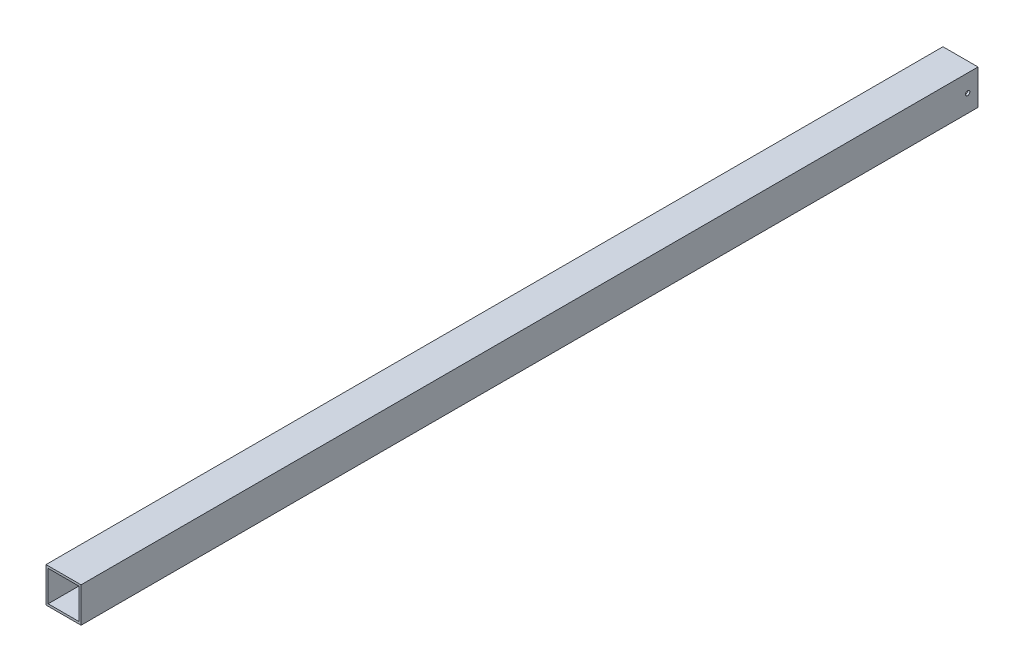
ISO-10303-21;
HEADER;
FILE_DESCRIPTION(('STEP AP214'),'2;1');
FILE_NAME('part.step','',(''),(''),'','','');
FILE_SCHEMA(('AUTOMOTIVE_DESIGN { 1 0 10303 214 1 1 1 1 }'));
ENDSEC;
DATA;
#1=APPLICATION_CONTEXT('core data for automotive mechanical design processes');
#2=APPLICATION_PROTOCOL_DEFINITION('international standard','automotive_design',2000,#1);
#3=PRODUCT_CONTEXT('',#1,'mechanical');
#4=PRODUCT('Part','Part','',(#3));
#5=PRODUCT_RELATED_PRODUCT_CATEGORY('part','',(#4));
#6=PRODUCT_DEFINITION_FORMATION('','',#4);
#7=PRODUCT_DEFINITION_CONTEXT('part definition',#1,'design');
#8=PRODUCT_DEFINITION('design','',#6,#7);
#9=PRODUCT_DEFINITION_SHAPE('','',#8);
#10=(LENGTH_UNIT() NAMED_UNIT(*) SI_UNIT(.MILLI.,.METRE.));
#11=(NAMED_UNIT(*) PLANE_ANGLE_UNIT() SI_UNIT($,.RADIAN.));
#12=(NAMED_UNIT(*) SI_UNIT($,.STERADIAN.) SOLID_ANGLE_UNIT());
#13=UNCERTAINTY_MEASURE_WITH_UNIT(LENGTH_MEASURE(1.E-05),#10,'distance_accuracy_value','');
#14=(GEOMETRIC_REPRESENTATION_CONTEXT(3) GLOBAL_UNCERTAINTY_ASSIGNED_CONTEXT((#13)) GLOBAL_UNIT_ASSIGNED_CONTEXT((#10,
#11,#12)) REPRESENTATION_CONTEXT('',''));
#15=CARTESIAN_POINT('',(0.,0.,0.));
#16=DIRECTION('',(0.,0.,1.));
#17=DIRECTION('',(1.,0.,0.));
#18=AXIS2_PLACEMENT_3D('',#15,#16,#17);
#19=CARTESIAN_POINT('',(-25.4,25.3999999999999,649.999999972));
#20=DIRECTION('',(1.,0.,0.));
#21=DIRECTION('',(0.,0.,-1.));
#22=AXIS2_PLACEMENT_3D('',#19,#20,#21);
#23=PLANE('',#22);
#24=CARTESIAN_POINT('',(-25.4,0.,-634.999999972));
#25=DIRECTION('',(-1.,0.,0.));
#26=DIRECTION('',(0.,0.,1.));
#27=AXIS2_PLACEMENT_3D('',#24,#25,#26);
#28=CIRCLE('',#27,3.17500000000008);
#29=CARTESIAN_POINT('',(-25.4,0.,-631.824999972));
#30=VERTEX_POINT('',#29);
#31=EDGE_CURVE('E282',#30,#30,#28,.T.);
#32=ORIENTED_EDGE('',*,*,#31,.F.);
#33=EDGE_LOOP('',(#32));
#34=FACE_BOUND('',#33,.T.);
#35=DIRECTION('',(0.,-1.,0.));
#36=VECTOR('',#35,1.);
#37=CARTESIAN_POINT('',(-25.4,25.3999999999999,-649.999999972));
#38=LINE('',#37,#36);
#39=CARTESIAN_POINT('',(-25.4,25.3999999999999,-649.999999972));
#40=VERTEX_POINT('',#39);
#41=CARTESIAN_POINT('',(-25.4,-25.3999999999999,-649.999999972));
#42=VERTEX_POINT('',#41);
#43=EDGE_CURVE('E159',#40,#42,#38,.T.);
#44=ORIENTED_EDGE('',*,*,#43,.T.);
#45=DIRECTION('',(0.,0.,-1.));
#46=VECTOR('',#45,1.);
#47=CARTESIAN_POINT('',(-25.4,-25.3999999999999,649.999999972));
#48=LINE('',#47,#46);
#49=CARTESIAN_POINT('',(-25.4,-25.3999999999999,649.999999972));
#50=VERTEX_POINT('',#49);
#51=EDGE_CURVE('E164',#50,#42,#48,.T.);
#52=ORIENTED_EDGE('',*,*,#51,.F.);
#53=DIRECTION('',(0.,-1.,0.));
#54=VECTOR('',#53,1.);
#55=CARTESIAN_POINT('',(-25.4,25.3999999999999,649.999999972));
#56=LINE('',#55,#54);
#57=CARTESIAN_POINT('',(-25.4,25.3999999999999,649.999999972));
#58=VERTEX_POINT('',#57);
#59=EDGE_CURVE('E150',#58,#50,#56,.T.);
#60=ORIENTED_EDGE('',*,*,#59,.F.);
#61=DIRECTION('',(0.,0.,-1.));
#62=VECTOR('',#61,1.);
#63=CARTESIAN_POINT('',(-25.4,25.3999999999999,649.999999972));
#64=LINE('',#63,#62);
#65=EDGE_CURVE('E48',#58,#40,#64,.T.);
#66=ORIENTED_EDGE('',*,*,#65,.T.);
#67=EDGE_LOOP('',(#44,#52,#60,#66));
#68=FACE_BOUND('',#67,.T.);
#69=CARTESIAN_POINT('',(-25.4,-3.17499999999772,597.099999971999));
#70=DIRECTION('',(-1.,0.,0.));
#71=DIRECTION('',(0.,0.,1.));
#72=AXIS2_PLACEMENT_3D('',#69,#70,#71);
#73=CIRCLE('',#72,2.425);
#74=CARTESIAN_POINT('',(-25.4,-3.17499999999772,599.524999971999));
#75=VERTEX_POINT('',#74);
#76=EDGE_CURVE('E273',#75,#75,#73,.T.);
#77=ORIENTED_EDGE('',*,*,#76,.F.);
#78=EDGE_LOOP('',(#77));
#79=FACE_BOUND('',#78,.T.);
#80=CARTESIAN_POINT('',(-25.4,-3.17499999999776,557.099999971999));
#81=DIRECTION('',(-1.,0.,0.));
#82=DIRECTION('',(0.,0.,1.));
#83=AXIS2_PLACEMENT_3D('',#80,#81,#82);
#84=CIRCLE('',#83,2.425);
#85=CARTESIAN_POINT('',(-25.4,-3.17499999999776,559.524999971999));
#86=VERTEX_POINT('',#85);
#87=EDGE_CURVE('E264',#86,#86,#84,.T.);
#88=ORIENTED_EDGE('',*,*,#87,.F.);
#89=EDGE_LOOP('',(#88));
#90=FACE_BOUND('',#89,.T.);
#91=CARTESIAN_POINT('',(-25.4,-3.17499999999779,517.099999971999));
#92=DIRECTION('',(-1.,0.,0.));
#93=DIRECTION('',(0.,0.,1.));
#94=AXIS2_PLACEMENT_3D('',#91,#92,#93);
#95=CIRCLE('',#94,2.425);
#96=CARTESIAN_POINT('',(-25.4,-3.17499999999779,519.524999971999));
#97=VERTEX_POINT('',#96);
#98=EDGE_CURVE('E256',#97,#97,#95,.T.);
#99=ORIENTED_EDGE('',*,*,#98,.F.);
#100=EDGE_LOOP('',(#99));
#101=FACE_BOUND('',#100,.T.);
#102=ADVANCED_FACE('F39',(#34,#68,#79,#90,#101),#23,.F.);
#103=CARTESIAN_POINT('',(0.,0.,649.999999972));
#104=DIRECTION('',(0.,0.,1.));
#105=DIRECTION('',(1.,0.,0.));
#106=AXIS2_PLACEMENT_3D('',#103,#104,#105);
#107=PLANE('',#106);
#108=DIRECTION('',(0.,1.,0.));
#109=VECTOR('',#108,1.);
#110=CARTESIAN_POINT('',(25.4,25.3999999999999,649.999999972));
#111=LINE('',#110,#109);
#112=CARTESIAN_POINT('',(25.4,-25.3999999999999,649.999999972));
#113=VERTEX_POINT('',#112);
#114=CARTESIAN_POINT('',(25.4,25.3999999999999,649.999999972));
#115=VERTEX_POINT('',#114);
#116=EDGE_CURVE('E144',#113,#115,#111,.T.);
#117=ORIENTED_EDGE('',*,*,#116,.T.);
#118=DIRECTION('',(-1.,0.,0.));
#119=VECTOR('',#118,1.);
#120=CARTESIAN_POINT('',(-25.4,25.3999999999999,649.999999972));
#121=LINE('',#120,#119);
#122=EDGE_CURVE('E147',#115,#58,#121,.T.);
#123=ORIENTED_EDGE('',*,*,#122,.T.);
#124=ORIENTED_EDGE('',*,*,#59,.T.);
#125=DIRECTION('',(1.,0.,0.));
#126=VECTOR('',#125,1.);
#127=CARTESIAN_POINT('',(-25.4,-25.3999999999999,649.999999972));
#128=LINE('',#127,#126);
#129=EDGE_CURVE('E152',#50,#113,#128,.T.);
#130=ORIENTED_EDGE('',*,*,#129,.T.);
#131=EDGE_LOOP('',(#117,#123,#124,#130));
#132=FACE_BOUND('',#131,.T.);
#133=DIRECTION('',(-1.,0.,0.));
#134=VECTOR('',#133,1.);
#135=CARTESIAN_POINT('',(-22.225,22.2249999999999,649.999999972));
#136=LINE('',#135,#134);
#137=CARTESIAN_POINT('',(22.225,22.2249999999999,649.999999972));
#138=VERTEX_POINT('',#137);
#139=CARTESIAN_POINT('',(-22.225,22.2249999999999,649.999999972));
#140=VERTEX_POINT('',#139);
#141=EDGE_CURVE('E113',#138,#140,#136,.T.);
#142=ORIENTED_EDGE('',*,*,#141,.F.);
#143=DIRECTION('',(0.,1.,0.));
#144=VECTOR('',#143,1.);
#145=CARTESIAN_POINT('',(22.225,22.2249999999999,649.999999972));
#146=LINE('',#145,#144);
#147=CARTESIAN_POINT('',(22.225,-22.2249999999999,649.999999972));
#148=VERTEX_POINT('',#147);
#149=EDGE_CURVE('E105',#148,#138,#146,.T.);
#150=ORIENTED_EDGE('',*,*,#149,.F.);
#151=DIRECTION('',(1.,0.,0.));
#152=VECTOR('',#151,1.);
#153=CARTESIAN_POINT('',(-22.225,-22.2249999999999,649.999999972));
#154=LINE('',#153,#152);
#155=CARTESIAN_POINT('',(-22.225,-22.2249999999999,649.999999972));
#156=VERTEX_POINT('',#155);
#157=EDGE_CURVE('E128',#156,#148,#154,.T.);
#158=ORIENTED_EDGE('',*,*,#157,.F.);
#159=DIRECTION('',(0.,-1.,0.));
#160=VECTOR('',#159,1.);
#161=CARTESIAN_POINT('',(-22.225,22.2249999999999,649.999999972));
#162=LINE('',#161,#160);
#163=EDGE_CURVE('E126',#140,#156,#162,.T.);
#164=ORIENTED_EDGE('',*,*,#163,.F.);
#165=EDGE_LOOP('',(#142,#150,#158,#164));
#166=FACE_BOUND('',#165,.T.);
#167=ADVANCED_FACE('F125',(#132,#166),#107,.T.);
#168=CARTESIAN_POINT('',(0.,0.,-649.999999972));
#169=DIRECTION('',(0.,0.,1.));
#170=DIRECTION('',(1.,0.,0.));
#171=AXIS2_PLACEMENT_3D('',#168,#169,#170);
#172=PLANE('',#171);
#173=DIRECTION('',(0.,1.,0.));
#174=VECTOR('',#173,1.);
#175=CARTESIAN_POINT('',(25.4,25.3999999999999,-649.999999972));
#176=LINE('',#175,#174);
#177=CARTESIAN_POINT('',(25.4,-25.3999999999999,-649.999999972));
#178=VERTEX_POINT('',#177);
#179=CARTESIAN_POINT('',(25.4,25.3999999999999,-649.999999972));
#180=VERTEX_POINT('',#179);
#181=EDGE_CURVE('E121',#178,#180,#176,.T.);
#182=ORIENTED_EDGE('',*,*,#181,.F.);
#183=DIRECTION('',(1.,0.,0.));
#184=VECTOR('',#183,1.);
#185=CARTESIAN_POINT('',(-25.4,-25.3999999999999,-649.999999972));
#186=LINE('',#185,#184);
#187=EDGE_CURVE('E148',#42,#178,#186,.T.);
#188=ORIENTED_EDGE('',*,*,#187,.F.);
#189=ORIENTED_EDGE('',*,*,#43,.F.);
#190=DIRECTION('',(-1.,0.,0.));
#191=VECTOR('',#190,1.);
#192=CARTESIAN_POINT('',(-25.4,25.3999999999999,-649.999999972));
#193=LINE('',#192,#191);
#194=EDGE_CURVE('E157',#180,#40,#193,.T.);
#195=ORIENTED_EDGE('',*,*,#194,.F.);
#196=EDGE_LOOP('',(#182,#188,#189,#195));
#197=FACE_BOUND('',#196,.T.);
#198=DIRECTION('',(0.,1.,0.));
#199=VECTOR('',#198,1.);
#200=CARTESIAN_POINT('',(22.225,22.2249999999999,-649.999999972));
#201=LINE('',#200,#199);
#202=CARTESIAN_POINT('',(22.225,-22.2249999999999,-649.999999972));
#203=VERTEX_POINT('',#202);
#204=CARTESIAN_POINT('',(22.225,22.2249999999999,-649.999999972));
#205=VERTEX_POINT('',#204);
#206=EDGE_CURVE('E63',#203,#205,#201,.T.);
#207=ORIENTED_EDGE('',*,*,#206,.T.);
#208=DIRECTION('',(-1.,0.,0.));
#209=VECTOR('',#208,1.);
#210=CARTESIAN_POINT('',(-22.225,22.2249999999999,-649.999999972));
#211=LINE('',#210,#209);
#212=CARTESIAN_POINT('',(-22.225,22.2249999999999,-649.999999972));
#213=VERTEX_POINT('',#212);
#214=EDGE_CURVE('E120',#205,#213,#211,.T.);
#215=ORIENTED_EDGE('',*,*,#214,.T.);
#216=DIRECTION('',(0.,-1.,0.));
#217=VECTOR('',#216,1.);
#218=CARTESIAN_POINT('',(-22.225,22.2249999999999,-649.999999972));
#219=LINE('',#218,#217);
#220=CARTESIAN_POINT('',(-22.225,-22.2249999999999,-649.999999972));
#221=VERTEX_POINT('',#220);
#222=EDGE_CURVE('E136',#213,#221,#219,.T.);
#223=ORIENTED_EDGE('',*,*,#222,.T.);
#224=DIRECTION('',(1.,0.,0.));
#225=VECTOR('',#224,1.);
#226=CARTESIAN_POINT('',(-22.225,-22.2249999999999,-649.999999972));
#227=LINE('',#226,#225);
#228=EDGE_CURVE('E114',#221,#203,#227,.T.);
#229=ORIENTED_EDGE('',*,*,#228,.T.);
#230=EDGE_LOOP('',(#207,#215,#223,#229));
#231=FACE_BOUND('',#230,.T.);
#232=ADVANCED_FACE('F178',(#197,#231),#172,.F.);
#233=CARTESIAN_POINT('',(25.4,25.3999999999999,649.999999972));
#234=DIRECTION('',(-1.,0.,0.));
#235=DIRECTION('',(0.,0.,1.));
#236=AXIS2_PLACEMENT_3D('',#233,#234,#235);
#237=PLANE('',#236);
#238=CARTESIAN_POINT('',(25.4,0.,-634.999999972));
#239=DIRECTION('',(-1.,0.,0.));
#240=DIRECTION('',(0.,0.,1.));
#241=AXIS2_PLACEMENT_3D('',#238,#239,#240);
#242=CIRCLE('',#241,3.17500000000008);
#243=CARTESIAN_POINT('',(25.4,0.,-631.824999972));
#244=VERTEX_POINT('',#243);
#245=EDGE_CURVE('E283',#244,#244,#242,.T.);
#246=ORIENTED_EDGE('',*,*,#245,.T.);
#247=EDGE_LOOP('',(#246));
#248=FACE_BOUND('',#247,.T.);
#249=ORIENTED_EDGE('',*,*,#181,.T.);
#250=DIRECTION('',(0.,0.,-1.));
#251=VECTOR('',#250,1.);
#252=CARTESIAN_POINT('',(25.4,25.3999999999999,649.999999972));
#253=LINE('',#252,#251);
#254=EDGE_CURVE('E11',#115,#180,#253,.T.);
#255=ORIENTED_EDGE('',*,*,#254,.F.);
#256=ORIENTED_EDGE('',*,*,#116,.F.);
#257=DIRECTION('',(0.,0.,-1.));
#258=VECTOR('',#257,1.);
#259=CARTESIAN_POINT('',(25.4,-25.3999999999999,649.999999972));
#260=LINE('',#259,#258);
#261=EDGE_CURVE('E154',#113,#178,#260,.T.);
#262=ORIENTED_EDGE('',*,*,#261,.T.);
#263=EDGE_LOOP('',(#249,#255,#256,#262));
#264=FACE_BOUND('',#263,.T.);
#265=ADVANCED_FACE('F41',(#248,#264),#237,.F.);
#266=CARTESIAN_POINT('',(-25.4,25.3999999999999,649.999999972));
#267=DIRECTION('',(0.,-1.,0.));
#268=DIRECTION('',(0.,0.,-1.));
#269=AXIS2_PLACEMENT_3D('',#266,#267,#268);
#270=PLANE('',#269);
#271=ORIENTED_EDGE('',*,*,#194,.T.);
#272=ORIENTED_EDGE('',*,*,#65,.F.);
#273=ORIENTED_EDGE('',*,*,#122,.F.);
#274=ORIENTED_EDGE('',*,*,#254,.T.);
#275=EDGE_LOOP('',(#271,#272,#273,#274));
#276=FACE_BOUND('',#275,.T.);
#277=ADVANCED_FACE('F188',(#276),#270,.F.);
#278=CARTESIAN_POINT('',(-25.4,-25.3999999999999,649.999999972));
#279=DIRECTION('',(0.,1.,0.));
#280=DIRECTION('',(0.,0.,1.));
#281=AXIS2_PLACEMENT_3D('',#278,#279,#280);
#282=PLANE('',#281);
#283=ORIENTED_EDGE('',*,*,#187,.T.);
#284=ORIENTED_EDGE('',*,*,#261,.F.);
#285=ORIENTED_EDGE('',*,*,#129,.F.);
#286=ORIENTED_EDGE('',*,*,#51,.T.);
#287=EDGE_LOOP('',(#283,#284,#285,#286));
#288=FACE_BOUND('',#287,.T.);
#289=ADVANCED_FACE('F182',(#288),#282,.F.);
#290=CARTESIAN_POINT('',(22.225,22.2249999999999,649.999999972));
#291=DIRECTION('',(-1.,0.,0.));
#292=DIRECTION('',(0.,0.,1.));
#293=AXIS2_PLACEMENT_3D('',#290,#291,#292);
#294=PLANE('',#293);
#295=CARTESIAN_POINT('',(22.225,0.,-634.999999972));
#296=DIRECTION('',(-1.,0.,0.));
#297=DIRECTION('',(0.,0.,1.));
#298=AXIS2_PLACEMENT_3D('',#295,#296,#297);
#299=CIRCLE('',#298,3.17500000000008);
#300=CARTESIAN_POINT('',(22.225,0.,-631.824999972));
#301=VERTEX_POINT('',#300);
#302=EDGE_CURVE('E134',#301,#301,#299,.T.);
#303=ORIENTED_EDGE('',*,*,#302,.F.);
#304=EDGE_LOOP('',(#303));
#305=FACE_BOUND('',#304,.T.);
#306=ORIENTED_EDGE('',*,*,#206,.F.);
#307=DIRECTION('',(0.,0.,-1.));
#308=VECTOR('',#307,1.);
#309=CARTESIAN_POINT('',(22.225,-22.2249999999999,649.999999972));
#310=LINE('',#309,#308);
#311=EDGE_CURVE('E109',#148,#203,#310,.T.);
#312=ORIENTED_EDGE('',*,*,#311,.F.);
#313=ORIENTED_EDGE('',*,*,#149,.T.);
#314=DIRECTION('',(0.,0.,-1.));
#315=VECTOR('',#314,1.);
#316=CARTESIAN_POINT('',(22.225,22.2249999999999,649.999999972));
#317=LINE('',#316,#315);
#318=EDGE_CURVE('E108',#138,#205,#317,.T.);
#319=ORIENTED_EDGE('',*,*,#318,.T.);
#320=EDGE_LOOP('',(#306,#312,#313,#319));
#321=FACE_BOUND('',#320,.T.);
#322=ADVANCED_FACE('F107',(#305,#321),#294,.T.);
#323=CARTESIAN_POINT('',(-22.225,22.2249999999999,649.999999972));
#324=DIRECTION('',(0.,-1.,0.));
#325=DIRECTION('',(0.,0.,-1.));
#326=AXIS2_PLACEMENT_3D('',#323,#324,#325);
#327=PLANE('',#326);
#328=ORIENTED_EDGE('',*,*,#214,.F.);
#329=ORIENTED_EDGE('',*,*,#318,.F.);
#330=ORIENTED_EDGE('',*,*,#141,.T.);
#331=DIRECTION('',(0.,0.,-1.));
#332=VECTOR('',#331,1.);
#333=CARTESIAN_POINT('',(-22.225,22.2249999999999,649.999999972));
#334=LINE('',#333,#332);
#335=EDGE_CURVE('E122',#140,#213,#334,.T.);
#336=ORIENTED_EDGE('',*,*,#335,.T.);
#337=EDGE_LOOP('',(#328,#329,#330,#336));
#338=FACE_BOUND('',#337,.T.);
#339=ADVANCED_FACE('F117',(#338),#327,.T.);
#340=CARTESIAN_POINT('',(-22.225,22.2249999999999,649.999999972));
#341=DIRECTION('',(1.,0.,0.));
#342=DIRECTION('',(0.,0.,-1.));
#343=AXIS2_PLACEMENT_3D('',#340,#341,#342);
#344=PLANE('',#343);
#345=CARTESIAN_POINT('',(-22.225,-3.17499999999779,517.099999971999));
#346=DIRECTION('',(1.,0.,0.));
#347=DIRECTION('',(0.,0.,-1.));
#348=AXIS2_PLACEMENT_3D('',#345,#346,#347);
#349=CIRCLE('',#348,2.25);
#350=CARTESIAN_POINT('',(-22.225,-3.17499999999779,514.849999971999));
#351=VERTEX_POINT('',#350);
#352=EDGE_CURVE('E259',#351,#351,#349,.T.);
#353=ORIENTED_EDGE('',*,*,#352,.F.);
#354=EDGE_LOOP('',(#353));
#355=FACE_BOUND('',#354,.T.);
#356=CARTESIAN_POINT('',(-22.225,-3.17499999999776,557.099999971999));
#357=DIRECTION('',(1.,0.,0.));
#358=DIRECTION('',(0.,0.,-1.));
#359=AXIS2_PLACEMENT_3D('',#356,#357,#358);
#360=CIRCLE('',#359,2.25);
#361=CARTESIAN_POINT('',(-22.225,-3.17499999999776,554.849999971999));
#362=VERTEX_POINT('',#361);
#363=EDGE_CURVE('E270',#362,#362,#360,.T.);
#364=ORIENTED_EDGE('',*,*,#363,.F.);
#365=EDGE_LOOP('',(#364));
#366=FACE_BOUND('',#365,.T.);
#367=CARTESIAN_POINT('',(-22.225,-3.17499999999772,597.099999971999));
#368=DIRECTION('',(1.,0.,0.));
#369=DIRECTION('',(0.,0.,-1.));
#370=AXIS2_PLACEMENT_3D('',#367,#368,#369);
#371=CIRCLE('',#370,2.25);
#372=CARTESIAN_POINT('',(-22.225,-3.17499999999772,594.849999971999));
#373=VERTEX_POINT('',#372);
#374=EDGE_CURVE('E279',#373,#373,#371,.T.);
#375=ORIENTED_EDGE('',*,*,#374,.F.);
#376=EDGE_LOOP('',(#375));
#377=FACE_BOUND('',#376,.T.);
#378=CARTESIAN_POINT('',(-22.225,0.,-634.999999972));
#379=DIRECTION('',(1.,0.,0.));
#380=DIRECTION('',(0.,0.,-1.));
#381=AXIS2_PLACEMENT_3D('',#378,#379,#380);
#382=CIRCLE('',#381,3.17500000000008);
#383=CARTESIAN_POINT('',(-22.225,0.,-638.174999972));
#384=VERTEX_POINT('',#383);
#385=EDGE_CURVE('E43',#384,#384,#382,.T.);
#386=ORIENTED_EDGE('',*,*,#385,.F.);
#387=EDGE_LOOP('',(#386));
#388=FACE_BOUND('',#387,.T.);
#389=ORIENTED_EDGE('',*,*,#222,.F.);
#390=ORIENTED_EDGE('',*,*,#335,.F.);
#391=ORIENTED_EDGE('',*,*,#163,.T.);
#392=DIRECTION('',(0.,0.,-1.));
#393=VECTOR('',#392,1.);
#394=CARTESIAN_POINT('',(-22.225,-22.2249999999999,649.999999972));
#395=LINE('',#394,#393);
#396=EDGE_CURVE('E55',#156,#221,#395,.T.);
#397=ORIENTED_EDGE('',*,*,#396,.T.);
#398=EDGE_LOOP('',(#389,#390,#391,#397));
#399=FACE_BOUND('',#398,.T.);
#400=ADVANCED_FACE('F214',(#355,#366,#377,#388,#399),#344,.T.);
#401=CARTESIAN_POINT('',(-22.225,-22.2249999999999,649.999999972));
#402=DIRECTION('',(0.,1.,0.));
#403=DIRECTION('',(0.,0.,1.));
#404=AXIS2_PLACEMENT_3D('',#401,#402,#403);
#405=PLANE('',#404);
#406=ORIENTED_EDGE('',*,*,#228,.F.);
#407=ORIENTED_EDGE('',*,*,#396,.F.);
#408=ORIENTED_EDGE('',*,*,#157,.T.);
#409=ORIENTED_EDGE('',*,*,#311,.T.);
#410=EDGE_LOOP('',(#406,#407,#408,#409));
#411=FACE_BOUND('',#410,.T.);
#412=ADVANCED_FACE('F216',(#411),#405,.T.);
#413=CARTESIAN_POINT('',(25.4,0.,-634.999999972));
#414=DIRECTION('',(-1.,0.,0.));
#415=DIRECTION('',(0.,0.,1.));
#416=AXIS2_PLACEMENT_3D('',#413,#414,#415);
#417=CYLINDRICAL_SURFACE('',#416,3.17500000000008);
#418=ORIENTED_EDGE('',*,*,#385,.T.);
#419=EDGE_LOOP('',(#418));
#420=FACE_BOUND('',#419,.T.);
#421=ORIENTED_EDGE('',*,*,#31,.T.);
#422=EDGE_LOOP('',(#421));
#423=FACE_BOUND('',#422,.T.);
#424=ADVANCED_FACE('F220',(#420,#423),#417,.F.);
#425=ORIENTED_EDGE('',*,*,#302,.T.);
#426=EDGE_LOOP('',(#425));
#427=FACE_BOUND('',#426,.T.);
#428=ORIENTED_EDGE('',*,*,#245,.F.);
#429=EDGE_LOOP('',(#428));
#430=FACE_BOUND('',#429,.T.);
#431=ADVANCED_FACE('F223',(#427,#430),#417,.F.);
#432=CARTESIAN_POINT('',(-25.4,-3.17499999999772,597.099999971999));
#433=DIRECTION('',(-1.,0.,0.));
#434=DIRECTION('',(0.,0.,1.));
#435=AXIS2_PLACEMENT_3D('',#432,#433,#434);
#436=CYLINDRICAL_SURFACE('',#435,2.25);
#437=CARTESIAN_POINT('',(-25.225,-3.17499999999772,597.099999971999));
#438=DIRECTION('',(-1.,0.,0.));
#439=DIRECTION('',(0.,0.,1.));
#440=AXIS2_PLACEMENT_3D('',#437,#438,#439);
#441=CIRCLE('',#440,2.25);
#442=CARTESIAN_POINT('',(-25.225,-3.17499999999772,599.349999971999));
#443=VERTEX_POINT('',#442);
#444=EDGE_CURVE('E276',#443,#443,#441,.T.);
#445=ORIENTED_EDGE('',*,*,#444,.T.);
#446=EDGE_LOOP('',(#445));
#447=FACE_BOUND('',#446,.T.);
#448=ORIENTED_EDGE('',*,*,#374,.T.);
#449=EDGE_LOOP('',(#448));
#450=FACE_BOUND('',#449,.T.);
#451=ADVANCED_FACE('F225',(#447,#450),#436,.F.);
#452=CARTESIAN_POINT('',(-25.4,-3.17499999999772,597.099999971999));
#453=DIRECTION('',(-1.,0.,0.));
#454=DIRECTION('',(0.,0.,1.));
#455=AXIS2_PLACEMENT_3D('',#452,#453,#454);
#456=CONICAL_SURFACE('',#455,2.425,0.785398163397456);
#457=ORIENTED_EDGE('',*,*,#444,.F.);
#458=EDGE_LOOP('',(#457));
#459=FACE_BOUND('',#458,.T.);
#460=ORIENTED_EDGE('',*,*,#76,.T.);
#461=EDGE_LOOP('',(#460));
#462=FACE_BOUND('',#461,.T.);
#463=ADVANCED_FACE('F228',(#459,#462),#456,.F.);
#464=CARTESIAN_POINT('',(-25.4,-3.17499999999776,557.099999971999));
#465=DIRECTION('',(-1.,0.,0.));
#466=DIRECTION('',(0.,0.,1.));
#467=AXIS2_PLACEMENT_3D('',#464,#465,#466);
#468=CYLINDRICAL_SURFACE('',#467,2.25);
#469=CARTESIAN_POINT('',(-25.225,-3.17499999999776,557.099999971999));
#470=DIRECTION('',(-1.,0.,0.));
#471=DIRECTION('',(0.,0.,1.));
#472=AXIS2_PLACEMENT_3D('',#469,#470,#471);
#473=CIRCLE('',#472,2.25);
#474=CARTESIAN_POINT('',(-25.225,-3.17499999999776,559.349999971999));
#475=VERTEX_POINT('',#474);
#476=EDGE_CURVE('E267',#475,#475,#473,.T.);
#477=ORIENTED_EDGE('',*,*,#476,.T.);
#478=EDGE_LOOP('',(#477));
#479=FACE_BOUND('',#478,.T.);
#480=ORIENTED_EDGE('',*,*,#363,.T.);
#481=EDGE_LOOP('',(#480));
#482=FACE_BOUND('',#481,.T.);
#483=ADVANCED_FACE('F232',(#479,#482),#468,.F.);
#484=CARTESIAN_POINT('',(-25.4,-3.17499999999776,557.099999971999));
#485=DIRECTION('',(-1.,0.,0.));
#486=DIRECTION('',(0.,0.,1.));
#487=AXIS2_PLACEMENT_3D('',#484,#485,#486);
#488=CONICAL_SURFACE('',#487,2.425,0.785398163397456);
#489=ORIENTED_EDGE('',*,*,#476,.F.);
#490=EDGE_LOOP('',(#489));
#491=FACE_BOUND('',#490,.T.);
#492=ORIENTED_EDGE('',*,*,#87,.T.);
#493=EDGE_LOOP('',(#492));
#494=FACE_BOUND('',#493,.T.);
#495=ADVANCED_FACE('F236',(#491,#494),#488,.F.);
#496=CARTESIAN_POINT('',(-25.4,-3.17499999999779,517.099999971999));
#497=DIRECTION('',(-1.,0.,0.));
#498=DIRECTION('',(0.,0.,1.));
#499=AXIS2_PLACEMENT_3D('',#496,#497,#498);
#500=CYLINDRICAL_SURFACE('',#499,2.25);
#501=CARTESIAN_POINT('',(-25.225,-3.17499999999779,517.099999971999));
#502=DIRECTION('',(-1.,0.,0.));
#503=DIRECTION('',(0.,0.,1.));
#504=AXIS2_PLACEMENT_3D('',#501,#502,#503);
#505=CIRCLE('',#504,2.25);
#506=CARTESIAN_POINT('',(-25.225,-3.17499999999779,519.349999971999));
#507=VERTEX_POINT('',#506);
#508=EDGE_CURVE('E253',#507,#507,#505,.T.);
#509=ORIENTED_EDGE('',*,*,#508,.T.);
#510=EDGE_LOOP('',(#509));
#511=FACE_BOUND('',#510,.T.);
#512=ORIENTED_EDGE('',*,*,#352,.T.);
#513=EDGE_LOOP('',(#512));
#514=FACE_BOUND('',#513,.T.);
#515=ADVANCED_FACE('F240',(#511,#514),#500,.F.);
#516=CARTESIAN_POINT('',(-25.4,-3.17499999999779,517.099999971999));
#517=DIRECTION('',(-1.,0.,0.));
#518=DIRECTION('',(0.,0.,1.));
#519=AXIS2_PLACEMENT_3D('',#516,#517,#518);
#520=CONICAL_SURFACE('',#519,2.425,0.785398163397456);
#521=ORIENTED_EDGE('',*,*,#508,.F.);
#522=EDGE_LOOP('',(#521));
#523=FACE_BOUND('',#522,.T.);
#524=ORIENTED_EDGE('',*,*,#98,.T.);
#525=EDGE_LOOP('',(#524));
#526=FACE_BOUND('',#525,.T.);
#527=ADVANCED_FACE('F244',(#523,#526),#520,.F.);
#528=CLOSED_SHELL('',(#102,#167,#232,#265,#277,#289,#322,#339,#400,#412,#424,#431,#451,#463,
#483,#495,#515,#527));
#529=MANIFOLD_SOLID_BREP('B2',#528);
#530=ADVANCED_BREP_SHAPE_REPRESENTATION('',(#18,#529),#14);
#531=SHAPE_DEFINITION_REPRESENTATION(#9,#530);
ENDSEC;
END-ISO-10303-21;
